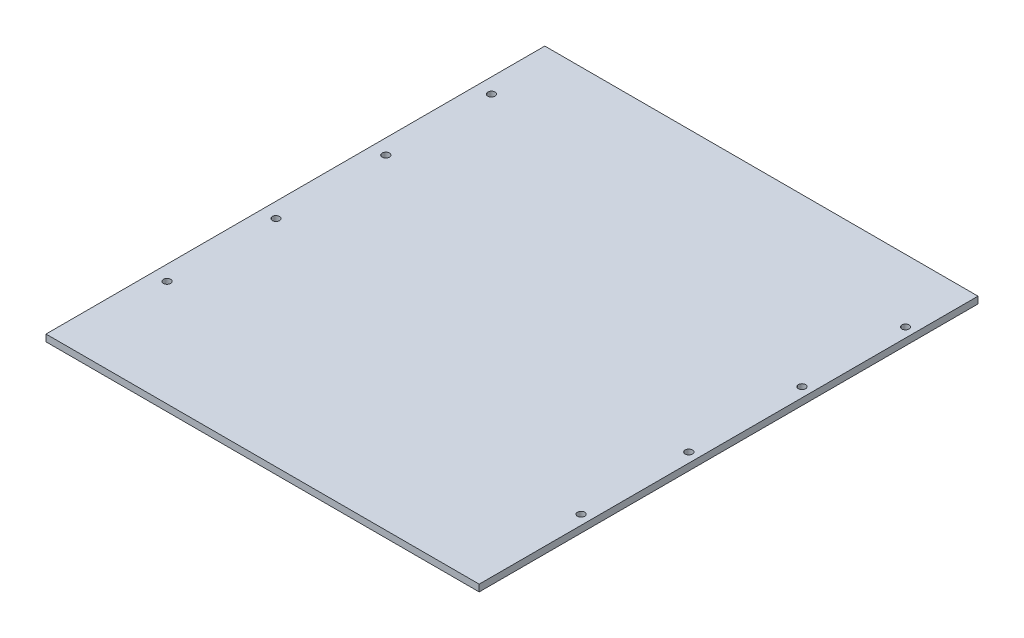
ISO-10303-21;
HEADER;
FILE_DESCRIPTION(('STEP AP214'),'2;1');
FILE_NAME('part.step','',(''),(''),'','','');
FILE_SCHEMA(('AUTOMOTIVE_DESIGN { 1 0 10303 214 1 1 1 1 }'));
ENDSEC;
DATA;
#1=APPLICATION_CONTEXT('core data for automotive mechanical design processes');
#2=APPLICATION_PROTOCOL_DEFINITION('international standard','automotive_design',2000,#1);
#3=PRODUCT_CONTEXT('',#1,'mechanical');
#4=PRODUCT('Part','Part','',(#3));
#5=PRODUCT_RELATED_PRODUCT_CATEGORY('part','',(#4));
#6=PRODUCT_DEFINITION_FORMATION('','',#4);
#7=PRODUCT_DEFINITION_CONTEXT('part definition',#1,'design');
#8=PRODUCT_DEFINITION('design','',#6,#7);
#9=PRODUCT_DEFINITION_SHAPE('','',#8);
#10=(LENGTH_UNIT() NAMED_UNIT(*) SI_UNIT(.MILLI.,.METRE.));
#11=(NAMED_UNIT(*) PLANE_ANGLE_UNIT() SI_UNIT($,.RADIAN.));
#12=(NAMED_UNIT(*) SI_UNIT($,.STERADIAN.) SOLID_ANGLE_UNIT());
#13=UNCERTAINTY_MEASURE_WITH_UNIT(LENGTH_MEASURE(1.E-05),#10,'distance_accuracy_value','');
#14=(GEOMETRIC_REPRESENTATION_CONTEXT(3) GLOBAL_UNCERTAINTY_ASSIGNED_CONTEXT((#13)) GLOBAL_UNIT_ASSIGNED_CONTEXT((#10,
#11,#12)) REPRESENTATION_CONTEXT('',''));
#15=CARTESIAN_POINT('',(0.,0.,0.));
#16=DIRECTION('',(0.,0.,1.));
#17=DIRECTION('',(1.,0.,0.));
#18=AXIS2_PLACEMENT_3D('',#15,#16,#17);
#19=CARTESIAN_POINT('',(0.,3.175,0.));
#20=DIRECTION('',(1.,0.,0.));
#21=DIRECTION('',(0.,0.,-1.));
#22=AXIS2_PLACEMENT_3D('',#19,#20,#21);
#23=PLANE('',#22);
#24=DIRECTION('',(0.,0.,1.));
#25=VECTOR('',#24,1.);
#26=CARTESIAN_POINT('',(0.,0.,0.));
#27=LINE('',#26,#25);
#28=CARTESIAN_POINT('',(0.,0.,-238.));
#29=VERTEX_POINT('',#28);
#30=CARTESIAN_POINT('',(0.,0.,-4.25));
#31=VERTEX_POINT('',#30);
#32=EDGE_CURVE('E95',#29,#31,#27,.T.);
#33=ORIENTED_EDGE('',*,*,#32,.T.);
#34=DIRECTION('',(0.,1.,0.));
#35=VECTOR('',#34,1.);
#36=CARTESIAN_POINT('',(0.,0.,-4.25));
#37=LINE('',#36,#35);
#38=CARTESIAN_POINT('',(0.,3.175,-4.25));
#39=VERTEX_POINT('',#38);
#40=EDGE_CURVE('E60',#31,#39,#37,.T.);
#41=ORIENTED_EDGE('',*,*,#40,.T.);
#42=DIRECTION('',(0.,0.,1.));
#43=VECTOR('',#42,1.);
#44=CARTESIAN_POINT('',(0.,3.175,0.));
#45=LINE('',#44,#43);
#46=CARTESIAN_POINT('',(0.,3.175,-238.));
#47=VERTEX_POINT('',#46);
#48=EDGE_CURVE('E90',#47,#39,#45,.T.);
#49=ORIENTED_EDGE('',*,*,#48,.F.);
#50=DIRECTION('',(0.,-1.,0.));
#51=VECTOR('',#50,1.);
#52=CARTESIAN_POINT('',(0.,3.175,-238.));
#53=LINE('',#52,#51);
#54=EDGE_CURVE('E53',#47,#29,#53,.T.);
#55=ORIENTED_EDGE('',*,*,#54,.T.);
#56=EDGE_LOOP('',(#33,#41,#49,#55));
#57=FACE_BOUND('',#56,.T.);
#58=ADVANCED_FACE('F45',(#57),#23,.F.);
#59=CARTESIAN_POINT('',(203.,3.175,0.));
#60=DIRECTION('',(-1.,0.,0.));
#61=DIRECTION('',(0.,0.,1.));
#62=AXIS2_PLACEMENT_3D('',#59,#60,#61);
#63=PLANE('',#62);
#64=DIRECTION('',(0.,0.,-1.));
#65=VECTOR('',#64,1.);
#66=CARTESIAN_POINT('',(203.,3.175,0.));
#67=LINE('',#66,#65);
#68=CARTESIAN_POINT('',(203.,3.175,-4.25));
#69=VERTEX_POINT('',#68);
#70=CARTESIAN_POINT('',(203.,3.175,-238.));
#71=VERTEX_POINT('',#70);
#72=EDGE_CURVE('E112',#69,#71,#67,.T.);
#73=ORIENTED_EDGE('',*,*,#72,.F.);
#74=DIRECTION('',(0.,1.,0.));
#75=VECTOR('',#74,1.);
#76=CARTESIAN_POINT('',(203.,0.,-4.25));
#77=LINE('',#76,#75);
#78=CARTESIAN_POINT('',(203.,0.,-4.25));
#79=VERTEX_POINT('',#78);
#80=EDGE_CURVE('E176',#79,#69,#77,.T.);
#81=ORIENTED_EDGE('',*,*,#80,.F.);
#82=DIRECTION('',(0.,0.,-1.));
#83=VECTOR('',#82,1.);
#84=CARTESIAN_POINT('',(203.,0.,0.));
#85=LINE('',#84,#83);
#86=CARTESIAN_POINT('',(203.,0.,-238.));
#87=VERTEX_POINT('',#86);
#88=EDGE_CURVE('E91',#79,#87,#85,.T.);
#89=ORIENTED_EDGE('',*,*,#88,.T.);
#90=DIRECTION('',(0.,-1.,0.));
#91=VECTOR('',#90,1.);
#92=CARTESIAN_POINT('',(203.,3.175,-238.));
#93=LINE('',#92,#91);
#94=EDGE_CURVE('E11',#71,#87,#93,.T.);
#95=ORIENTED_EDGE('',*,*,#94,.F.);
#96=EDGE_LOOP('',(#73,#81,#89,#95));
#97=FACE_BOUND('',#96,.T.);
#98=ADVANCED_FACE('F203',(#97),#63,.F.);
#99=CARTESIAN_POINT('',(0.,3.175,-238.));
#100=DIRECTION('',(0.,0.,1.));
#101=DIRECTION('',(1.,0.,0.));
#102=AXIS2_PLACEMENT_3D('',#99,#100,#101);
#103=PLANE('',#102);
#104=DIRECTION('',(-1.,0.,0.));
#105=VECTOR('',#104,1.);
#106=CARTESIAN_POINT('',(0.,0.,-238.));
#107=LINE('',#106,#105);
#108=EDGE_CURVE('E81',#87,#29,#107,.T.);
#109=ORIENTED_EDGE('',*,*,#108,.T.);
#110=ORIENTED_EDGE('',*,*,#54,.F.);
#111=DIRECTION('',(-1.,0.,0.));
#112=VECTOR('',#111,1.);
#113=CARTESIAN_POINT('',(0.,3.175,-238.));
#114=LINE('',#113,#112);
#115=EDGE_CURVE('E69',#71,#47,#114,.T.);
#116=ORIENTED_EDGE('',*,*,#115,.F.);
#117=ORIENTED_EDGE('',*,*,#94,.T.);
#118=EDGE_LOOP('',(#109,#110,#116,#117));
#119=FACE_BOUND('',#118,.T.);
#120=ADVANCED_FACE('F83',(#119),#103,.F.);
#121=CARTESIAN_POINT('',(0.,3.175,0.));
#122=DIRECTION('',(0.,-1.,0.));
#123=DIRECTION('',(0.,0.,-1.));
#124=AXIS2_PLACEMENT_3D('',#121,#122,#123);
#125=PLANE('',#124);
#126=CARTESIAN_POINT('',(198.5,3.175,-208.5));
#127=DIRECTION('',(0.,1.,0.));
#128=DIRECTION('',(0.,0.,1.));
#129=AXIS2_PLACEMENT_3D('',#126,#127,#128);
#130=CIRCLE('',#129,1.70000000000001);
#131=CARTESIAN_POINT('',(198.5,3.175,-206.8));
#132=VERTEX_POINT('',#131);
#133=EDGE_CURVE('E169',#132,#132,#130,.T.);
#134=ORIENTED_EDGE('',*,*,#133,.F.);
#135=EDGE_LOOP('',(#134));
#136=FACE_BOUND('',#135,.T.);
#137=CARTESIAN_POINT('',(198.5,3.175,-160.));
#138=DIRECTION('',(0.,1.,0.));
#139=DIRECTION('',(0.,0.,1.));
#140=AXIS2_PLACEMENT_3D('',#137,#138,#139);
#141=CIRCLE('',#140,1.70000000000001);
#142=CARTESIAN_POINT('',(198.5,3.175,-158.3));
#143=VERTEX_POINT('',#142);
#144=EDGE_CURVE('E165',#143,#143,#141,.T.);
#145=ORIENTED_EDGE('',*,*,#144,.F.);
#146=EDGE_LOOP('',(#145));
#147=FACE_BOUND('',#146,.T.);
#148=CARTESIAN_POINT('',(198.5,3.175,-107.));
#149=DIRECTION('',(0.,1.,0.));
#150=DIRECTION('',(0.,0.,1.));
#151=AXIS2_PLACEMENT_3D('',#148,#149,#150);
#152=CIRCLE('',#151,1.70000000000001);
#153=CARTESIAN_POINT('',(198.5,3.175,-105.3));
#154=VERTEX_POINT('',#153);
#155=EDGE_CURVE('E157',#154,#154,#152,.T.);
#156=ORIENTED_EDGE('',*,*,#155,.F.);
#157=EDGE_LOOP('',(#156));
#158=FACE_BOUND('',#157,.T.);
#159=CARTESIAN_POINT('',(198.5,3.175,-56.5));
#160=DIRECTION('',(0.,1.,0.));
#161=DIRECTION('',(0.,0.,1.));
#162=AXIS2_PLACEMENT_3D('',#159,#160,#161);
#163=CIRCLE('',#162,1.70000000000001);
#164=CARTESIAN_POINT('',(198.5,3.175,-54.8));
#165=VERTEX_POINT('',#164);
#166=EDGE_CURVE('E149',#165,#165,#163,.T.);
#167=ORIENTED_EDGE('',*,*,#166,.F.);
#168=EDGE_LOOP('',(#167));
#169=FACE_BOUND('',#168,.T.);
#170=CARTESIAN_POINT('',(7.,3.175,-206.));
#171=DIRECTION('',(0.,1.,0.));
#172=DIRECTION('',(0.,0.,1.));
#173=AXIS2_PLACEMENT_3D('',#170,#171,#172);
#174=CIRCLE('',#173,1.7);
#175=CARTESIAN_POINT('',(7.,3.175,-204.3));
#176=VERTEX_POINT('',#175);
#177=EDGE_CURVE('E107',#176,#176,#174,.T.);
#178=ORIENTED_EDGE('',*,*,#177,.F.);
#179=EDGE_LOOP('',(#178));
#180=FACE_BOUND('',#179,.T.);
#181=CARTESIAN_POINT('',(7.00000000000001,3.175,-156.5));
#182=DIRECTION('',(0.,1.,0.));
#183=DIRECTION('',(0.,0.,1.));
#184=AXIS2_PLACEMENT_3D('',#181,#182,#183);
#185=CIRCLE('',#184,1.7);
#186=CARTESIAN_POINT('',(7.00000000000001,3.175,-154.8));
#187=VERTEX_POINT('',#186);
#188=EDGE_CURVE('E138',#187,#187,#185,.T.);
#189=ORIENTED_EDGE('',*,*,#188,.F.);
#190=EDGE_LOOP('',(#189));
#191=FACE_BOUND('',#190,.T.);
#192=CARTESIAN_POINT('',(7.00000000000001,3.175,-105.));
#193=DIRECTION('',(0.,1.,0.));
#194=DIRECTION('',(0.,0.,1.));
#195=AXIS2_PLACEMENT_3D('',#192,#193,#194);
#196=CIRCLE('',#195,1.7);
#197=CARTESIAN_POINT('',(7.00000000000001,3.175,-103.3));
#198=VERTEX_POINT('',#197);
#199=EDGE_CURVE('E130',#198,#198,#196,.T.);
#200=ORIENTED_EDGE('',*,*,#199,.F.);
#201=EDGE_LOOP('',(#200));
#202=FACE_BOUND('',#201,.T.);
#203=CARTESIAN_POINT('',(7.00000000000002,3.175,-54.));
#204=DIRECTION('',(0.,1.,0.));
#205=DIRECTION('',(0.,0.,1.));
#206=AXIS2_PLACEMENT_3D('',#203,#204,#205);
#207=CIRCLE('',#206,1.7);
#208=CARTESIAN_POINT('',(7.00000000000002,3.175,-52.3));
#209=VERTEX_POINT('',#208);
#210=EDGE_CURVE('E121',#209,#209,#207,.T.);
#211=ORIENTED_EDGE('',*,*,#210,.F.);
#212=EDGE_LOOP('',(#211));
#213=FACE_BOUND('',#212,.T.);
#214=ORIENTED_EDGE('',*,*,#48,.T.);
#215=DIRECTION('',(-1.,0.,0.));
#216=VECTOR('',#215,1.);
#217=CARTESIAN_POINT('',(0.,3.175,-4.25));
#218=LINE('',#217,#216);
#219=EDGE_CURVE('E182',#69,#39,#218,.T.);
#220=ORIENTED_EDGE('',*,*,#219,.F.);
#221=ORIENTED_EDGE('',*,*,#72,.T.);
#222=ORIENTED_EDGE('',*,*,#115,.T.);
#223=EDGE_LOOP('',(#214,#220,#221,#222));
#224=FACE_BOUND('',#223,.T.);
#225=ADVANCED_FACE('F192',(#136,#147,#158,#169,#180,#191,#202,#213,#224),#125,.F.);
#226=CARTESIAN_POINT('',(0.,0.,0.));
#227=DIRECTION('',(0.,-1.,0.));
#228=DIRECTION('',(0.,0.,-1.));
#229=AXIS2_PLACEMENT_3D('',#226,#227,#228);
#230=PLANE('',#229);
#231=DIRECTION('',(-1.,0.,0.));
#232=VECTOR('',#231,1.);
#233=CARTESIAN_POINT('',(0.,0.,-4.25));
#234=LINE('',#233,#232);
#235=EDGE_CURVE('E99',#79,#31,#234,.T.);
#236=ORIENTED_EDGE('',*,*,#235,.T.);
#237=ORIENTED_EDGE('',*,*,#32,.F.);
#238=ORIENTED_EDGE('',*,*,#108,.F.);
#239=ORIENTED_EDGE('',*,*,#88,.F.);
#240=EDGE_LOOP('',(#236,#237,#238,#239));
#241=FACE_BOUND('',#240,.T.);
#242=CARTESIAN_POINT('',(198.5,0.,-208.5));
#243=DIRECTION('',(0.,1.,0.));
#244=DIRECTION('',(0.,0.,1.));
#245=AXIS2_PLACEMENT_3D('',#242,#243,#244);
#246=CIRCLE('',#245,1.70000000000001);
#247=CARTESIAN_POINT('',(198.5,0.,-206.8));
#248=VERTEX_POINT('',#247);
#249=EDGE_CURVE('E122',#248,#248,#246,.T.);
#250=ORIENTED_EDGE('',*,*,#249,.T.);
#251=EDGE_LOOP('',(#250));
#252=FACE_BOUND('',#251,.T.);
#253=CARTESIAN_POINT('',(198.5,0.,-160.));
#254=DIRECTION('',(0.,1.,0.));
#255=DIRECTION('',(0.,0.,1.));
#256=AXIS2_PLACEMENT_3D('',#253,#254,#255);
#257=CIRCLE('',#256,1.70000000000001);
#258=CARTESIAN_POINT('',(198.5,0.,-158.3));
#259=VERTEX_POINT('',#258);
#260=EDGE_CURVE('E161',#259,#259,#257,.T.);
#261=ORIENTED_EDGE('',*,*,#260,.T.);
#262=EDGE_LOOP('',(#261));
#263=FACE_BOUND('',#262,.T.);
#264=CARTESIAN_POINT('',(198.5,0.,-107.));
#265=DIRECTION('',(0.,1.,0.));
#266=DIRECTION('',(0.,0.,1.));
#267=AXIS2_PLACEMENT_3D('',#264,#265,#266);
#268=CIRCLE('',#267,1.70000000000001);
#269=CARTESIAN_POINT('',(198.5,0.,-105.3));
#270=VERTEX_POINT('',#269);
#271=EDGE_CURVE('E153',#270,#270,#268,.T.);
#272=ORIENTED_EDGE('',*,*,#271,.T.);
#273=EDGE_LOOP('',(#272));
#274=FACE_BOUND('',#273,.T.);
#275=CARTESIAN_POINT('',(198.5,0.,-56.5));
#276=DIRECTION('',(0.,1.,0.));
#277=DIRECTION('',(0.,0.,1.));
#278=AXIS2_PLACEMENT_3D('',#275,#276,#277);
#279=CIRCLE('',#278,1.70000000000001);
#280=CARTESIAN_POINT('',(198.5,0.,-54.8));
#281=VERTEX_POINT('',#280);
#282=EDGE_CURVE('E145',#281,#281,#279,.T.);
#283=ORIENTED_EDGE('',*,*,#282,.T.);
#284=EDGE_LOOP('',(#283));
#285=FACE_BOUND('',#284,.T.);
#286=CARTESIAN_POINT('',(7.,0.,-206.));
#287=DIRECTION('',(0.,1.,0.));
#288=DIRECTION('',(0.,0.,1.));
#289=AXIS2_PLACEMENT_3D('',#286,#287,#288);
#290=CIRCLE('',#289,1.7);
#291=CARTESIAN_POINT('',(7.,0.,-204.3));
#292=VERTEX_POINT('',#291);
#293=EDGE_CURVE('E101',#292,#292,#290,.T.);
#294=ORIENTED_EDGE('',*,*,#293,.T.);
#295=EDGE_LOOP('',(#294));
#296=FACE_BOUND('',#295,.T.);
#297=CARTESIAN_POINT('',(7.00000000000001,0.,-156.5));
#298=DIRECTION('',(0.,1.,0.));
#299=DIRECTION('',(0.,0.,1.));
#300=AXIS2_PLACEMENT_3D('',#297,#298,#299);
#301=CIRCLE('',#300,1.7);
#302=CARTESIAN_POINT('',(7.00000000000001,0.,-154.8));
#303=VERTEX_POINT('',#302);
#304=EDGE_CURVE('E134',#303,#303,#301,.T.);
#305=ORIENTED_EDGE('',*,*,#304,.T.);
#306=EDGE_LOOP('',(#305));
#307=FACE_BOUND('',#306,.T.);
#308=CARTESIAN_POINT('',(7.00000000000001,0.,-105.));
#309=DIRECTION('',(0.,1.,0.));
#310=DIRECTION('',(0.,0.,1.));
#311=AXIS2_PLACEMENT_3D('',#308,#309,#310);
#312=CIRCLE('',#311,1.7);
#313=CARTESIAN_POINT('',(7.00000000000001,0.,-103.3));
#314=VERTEX_POINT('',#313);
#315=EDGE_CURVE('E126',#314,#314,#312,.T.);
#316=ORIENTED_EDGE('',*,*,#315,.T.);
#317=EDGE_LOOP('',(#316));
#318=FACE_BOUND('',#317,.T.);
#319=CARTESIAN_POINT('',(7.00000000000002,0.,-54.));
#320=DIRECTION('',(0.,1.,0.));
#321=DIRECTION('',(0.,0.,1.));
#322=AXIS2_PLACEMENT_3D('',#319,#320,#321);
#323=CIRCLE('',#322,1.7);
#324=CARTESIAN_POINT('',(7.00000000000002,0.,-52.3));
#325=VERTEX_POINT('',#324);
#326=EDGE_CURVE('E117',#325,#325,#323,.T.);
#327=ORIENTED_EDGE('',*,*,#326,.T.);
#328=EDGE_LOOP('',(#327));
#329=FACE_BOUND('',#328,.T.);
#330=ADVANCED_FACE('F97',(#241,#252,#263,#274,#285,#296,#307,#318,#329),#230,.T.);
#331=CARTESIAN_POINT('',(7.00000000000002,0.,-54.));
#332=DIRECTION('',(0.,1.,0.));
#333=DIRECTION('',(0.,0.,1.));
#334=AXIS2_PLACEMENT_3D('',#331,#332,#333);
#335=CYLINDRICAL_SURFACE('',#334,1.7);
#336=ORIENTED_EDGE('',*,*,#326,.F.);
#337=EDGE_LOOP('',(#336));
#338=FACE_BOUND('',#337,.T.);
#339=ORIENTED_EDGE('',*,*,#210,.T.);
#340=EDGE_LOOP('',(#339));
#341=FACE_BOUND('',#340,.T.);
#342=ADVANCED_FACE('F200',(#338,#341),#335,.F.);
#343=CARTESIAN_POINT('',(7.00000000000001,0.,-105.));
#344=DIRECTION('',(0.,1.,0.));
#345=DIRECTION('',(0.,0.,1.));
#346=AXIS2_PLACEMENT_3D('',#343,#344,#345);
#347=CYLINDRICAL_SURFACE('',#346,1.7);
#348=ORIENTED_EDGE('',*,*,#315,.F.);
#349=EDGE_LOOP('',(#348));
#350=FACE_BOUND('',#349,.T.);
#351=ORIENTED_EDGE('',*,*,#199,.T.);
#352=EDGE_LOOP('',(#351));
#353=FACE_BOUND('',#352,.T.);
#354=ADVANCED_FACE('F247',(#350,#353),#347,.F.);
#355=CARTESIAN_POINT('',(7.00000000000001,0.,-156.5));
#356=DIRECTION('',(0.,1.,0.));
#357=DIRECTION('',(0.,0.,1.));
#358=AXIS2_PLACEMENT_3D('',#355,#356,#357);
#359=CYLINDRICAL_SURFACE('',#358,1.7);
#360=ORIENTED_EDGE('',*,*,#304,.F.);
#361=EDGE_LOOP('',(#360));
#362=FACE_BOUND('',#361,.T.);
#363=ORIENTED_EDGE('',*,*,#188,.T.);
#364=EDGE_LOOP('',(#363));
#365=FACE_BOUND('',#364,.T.);
#366=ADVANCED_FACE('F256',(#362,#365),#359,.F.);
#367=CARTESIAN_POINT('',(7.,0.,-206.));
#368=DIRECTION('',(0.,1.,0.));
#369=DIRECTION('',(0.,0.,1.));
#370=AXIS2_PLACEMENT_3D('',#367,#368,#369);
#371=CYLINDRICAL_SURFACE('',#370,1.7);
#372=ORIENTED_EDGE('',*,*,#293,.F.);
#373=EDGE_LOOP('',(#372));
#374=FACE_BOUND('',#373,.T.);
#375=ORIENTED_EDGE('',*,*,#177,.T.);
#376=EDGE_LOOP('',(#375));
#377=FACE_BOUND('',#376,.T.);
#378=ADVANCED_FACE('F266',(#374,#377),#371,.F.);
#379=CARTESIAN_POINT('',(198.5,0.,-56.5));
#380=DIRECTION('',(0.,1.,0.));
#381=DIRECTION('',(0.,0.,1.));
#382=AXIS2_PLACEMENT_3D('',#379,#380,#381);
#383=CYLINDRICAL_SURFACE('',#382,1.70000000000001);
#384=ORIENTED_EDGE('',*,*,#282,.F.);
#385=EDGE_LOOP('',(#384));
#386=FACE_BOUND('',#385,.T.);
#387=ORIENTED_EDGE('',*,*,#166,.T.);
#388=EDGE_LOOP('',(#387));
#389=FACE_BOUND('',#388,.T.);
#390=ADVANCED_FACE('F276',(#386,#389),#383,.F.);
#391=CARTESIAN_POINT('',(198.5,0.,-107.));
#392=DIRECTION('',(0.,1.,0.));
#393=DIRECTION('',(0.,0.,1.));
#394=AXIS2_PLACEMENT_3D('',#391,#392,#393);
#395=CYLINDRICAL_SURFACE('',#394,1.70000000000001);
#396=ORIENTED_EDGE('',*,*,#271,.F.);
#397=EDGE_LOOP('',(#396));
#398=FACE_BOUND('',#397,.T.);
#399=ORIENTED_EDGE('',*,*,#155,.T.);
#400=EDGE_LOOP('',(#399));
#401=FACE_BOUND('',#400,.T.);
#402=ADVANCED_FACE('F286',(#398,#401),#395,.F.);
#403=CARTESIAN_POINT('',(198.5,0.,-160.));
#404=DIRECTION('',(0.,1.,0.));
#405=DIRECTION('',(0.,0.,1.));
#406=AXIS2_PLACEMENT_3D('',#403,#404,#405);
#407=CYLINDRICAL_SURFACE('',#406,1.70000000000001);
#408=ORIENTED_EDGE('',*,*,#260,.F.);
#409=EDGE_LOOP('',(#408));
#410=FACE_BOUND('',#409,.T.);
#411=ORIENTED_EDGE('',*,*,#144,.T.);
#412=EDGE_LOOP('',(#411));
#413=FACE_BOUND('',#412,.T.);
#414=ADVANCED_FACE('F296',(#410,#413),#407,.F.);
#415=CARTESIAN_POINT('',(198.5,0.,-208.5));
#416=DIRECTION('',(0.,1.,0.));
#417=DIRECTION('',(0.,0.,1.));
#418=AXIS2_PLACEMENT_3D('',#415,#416,#417);
#419=CYLINDRICAL_SURFACE('',#418,1.70000000000001);
#420=ORIENTED_EDGE('',*,*,#249,.F.);
#421=EDGE_LOOP('',(#420));
#422=FACE_BOUND('',#421,.T.);
#423=ORIENTED_EDGE('',*,*,#133,.T.);
#424=EDGE_LOOP('',(#423));
#425=FACE_BOUND('',#424,.T.);
#426=ADVANCED_FACE('F306',(#422,#425),#419,.F.);
#427=CARTESIAN_POINT('',(0.,0.,-4.25));
#428=DIRECTION('',(0.,0.,-1.));
#429=DIRECTION('',(-1.,0.,0.));
#430=AXIS2_PLACEMENT_3D('',#427,#428,#429);
#431=PLANE('',#430);
#432=ORIENTED_EDGE('',*,*,#219,.T.);
#433=ORIENTED_EDGE('',*,*,#40,.F.);
#434=ORIENTED_EDGE('',*,*,#235,.F.);
#435=ORIENTED_EDGE('',*,*,#80,.T.);
#436=EDGE_LOOP('',(#432,#433,#434,#435));
#437=FACE_BOUND('',#436,.T.);
#438=ADVANCED_FACE('F188',(#437),#431,.F.);
#439=CLOSED_SHELL('',(#58,#98,#120,#225,#330,#342,#354,#366,#378,#390,#402,#414,#426,#438));
#440=MANIFOLD_SOLID_BREP('B2',#439);
#441=ADVANCED_BREP_SHAPE_REPRESENTATION('',(#18,#440),#14);
#442=SHAPE_DEFINITION_REPRESENTATION(#9,#441);
ENDSEC;
END-ISO-10303-21;
